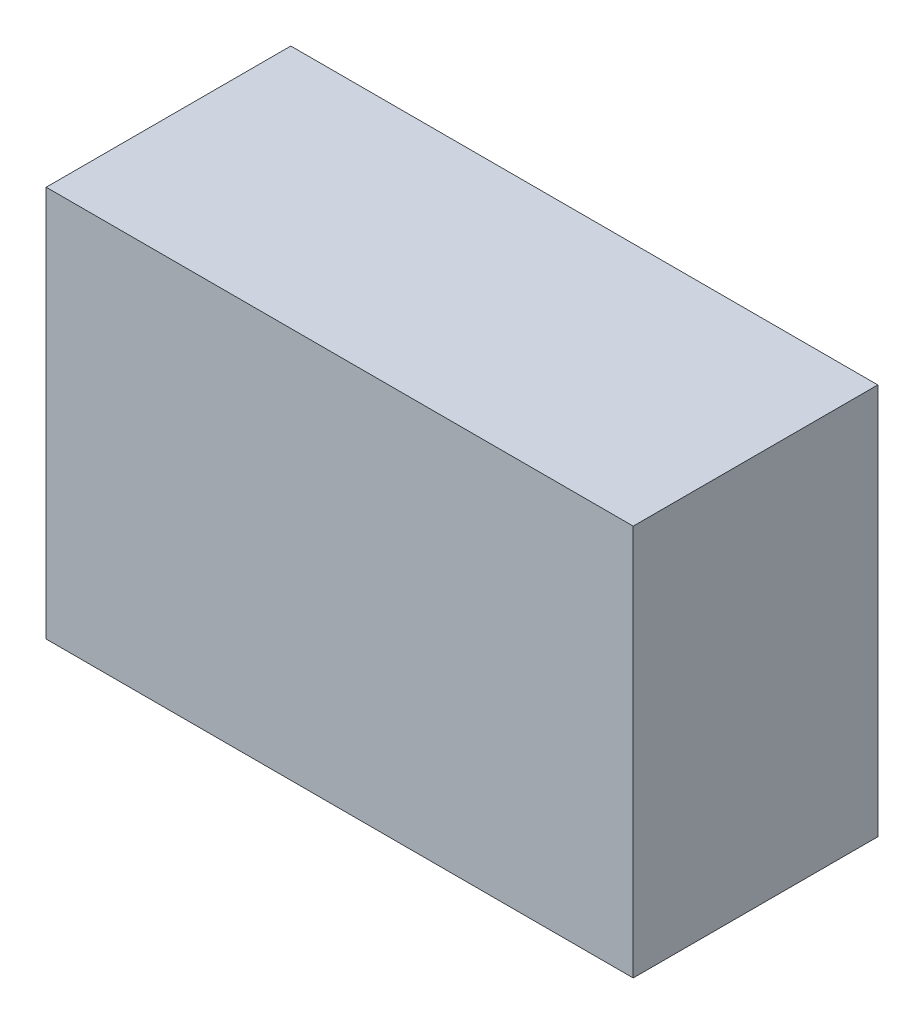
ISO-10303-21;
HEADER;
FILE_DESCRIPTION(('STEP AP214'),'2;1');
FILE_NAME('part.step','',(''),(''),'','','');
FILE_SCHEMA(('AUTOMOTIVE_DESIGN { 1 0 10303 214 1 1 1 1 }'));
ENDSEC;
DATA;
#1=APPLICATION_CONTEXT('core data for automotive mechanical design processes');
#2=APPLICATION_PROTOCOL_DEFINITION('international standard','automotive_design',2000,#1);
#3=PRODUCT_CONTEXT('',#1,'mechanical');
#4=PRODUCT('Part','Part','',(#3));
#5=PRODUCT_RELATED_PRODUCT_CATEGORY('part','',(#4));
#6=PRODUCT_DEFINITION_FORMATION('','',#4);
#7=PRODUCT_DEFINITION_CONTEXT('part definition',#1,'design');
#8=PRODUCT_DEFINITION('design','',#6,#7);
#9=PRODUCT_DEFINITION_SHAPE('','',#8);
#10=(LENGTH_UNIT() NAMED_UNIT(*) SI_UNIT(.MILLI.,.METRE.));
#11=(NAMED_UNIT(*) PLANE_ANGLE_UNIT() SI_UNIT($,.RADIAN.));
#12=(NAMED_UNIT(*) SI_UNIT($,.STERADIAN.) SOLID_ANGLE_UNIT());
#13=UNCERTAINTY_MEASURE_WITH_UNIT(LENGTH_MEASURE(1.E-05),#10,'distance_accuracy_value','');
#14=(GEOMETRIC_REPRESENTATION_CONTEXT(3) GLOBAL_UNCERTAINTY_ASSIGNED_CONTEXT((#13)) GLOBAL_UNIT_ASSIGNED_CONTEXT((#10,
#11,#12)) REPRESENTATION_CONTEXT('',''));
#15=CARTESIAN_POINT('',(0.,0.,0.));
#16=DIRECTION('',(0.,0.,1.));
#17=DIRECTION('',(1.,0.,0.));
#18=AXIS2_PLACEMENT_3D('',#15,#16,#17);
#19=CARTESIAN_POINT('',(0.,8.,5.));
#20=DIRECTION('',(1.,0.,0.));
#21=DIRECTION('',(0.,0.,-1.));
#22=AXIS2_PLACEMENT_3D('',#19,#20,#21);
#23=PLANE('',#22);
#24=DIRECTION('',(0.,-1.,0.));
#25=VECTOR('',#24,1.);
#26=CARTESIAN_POINT('',(0.,8.,0.));
#27=LINE('',#26,#25);
#28=CARTESIAN_POINT('',(0.,8.,0.));
#29=VERTEX_POINT('',#28);
#30=CARTESIAN_POINT('',(0.,0.,0.));
#31=VERTEX_POINT('',#30);
#32=EDGE_CURVE('E102',#29,#31,#27,.T.);
#33=ORIENTED_EDGE('',*,*,#32,.T.);
#34=DIRECTION('',(0.,0.,-1.));
#35=VECTOR('',#34,1.);
#36=CARTESIAN_POINT('',(0.,0.,5.));
#37=LINE('',#36,#35);
#38=CARTESIAN_POINT('',(0.,0.,5.));
#39=VERTEX_POINT('',#38);
#40=EDGE_CURVE('E11',#39,#31,#37,.T.);
#41=ORIENTED_EDGE('',*,*,#40,.F.);
#42=DIRECTION('',(0.,-1.,0.));
#43=VECTOR('',#42,1.);
#44=CARTESIAN_POINT('',(0.,8.,5.));
#45=LINE('',#44,#43);
#46=CARTESIAN_POINT('',(0.,8.,5.));
#47=VERTEX_POINT('',#46);
#48=EDGE_CURVE('E90',#47,#39,#45,.T.);
#49=ORIENTED_EDGE('',*,*,#48,.F.);
#50=DIRECTION('',(0.,0.,-1.));
#51=VECTOR('',#50,1.);
#52=CARTESIAN_POINT('',(0.,8.,5.));
#53=LINE('',#52,#51);
#54=EDGE_CURVE('E98',#47,#29,#53,.T.);
#55=ORIENTED_EDGE('',*,*,#54,.T.);
#56=EDGE_LOOP('',(#33,#41,#49,#55));
#57=FACE_BOUND('',#56,.T.);
#58=ADVANCED_FACE('F39',(#57),#23,.F.);
#59=CARTESIAN_POINT('',(0.,0.,5.));
#60=DIRECTION('',(0.,1.,0.));
#61=DIRECTION('',(0.,0.,1.));
#62=AXIS2_PLACEMENT_3D('',#59,#60,#61);
#63=PLANE('',#62);
#64=DIRECTION('',(1.,0.,0.));
#65=VECTOR('',#64,1.);
#66=CARTESIAN_POINT('',(0.,0.,0.));
#67=LINE('',#66,#65);
#68=CARTESIAN_POINT('',(12.,0.,0.));
#69=VERTEX_POINT('',#68);
#70=EDGE_CURVE('E94',#31,#69,#67,.T.);
#71=ORIENTED_EDGE('',*,*,#70,.T.);
#72=DIRECTION('',(0.,0.,-1.));
#73=VECTOR('',#72,1.);
#74=CARTESIAN_POINT('',(12.,0.,5.));
#75=LINE('',#74,#73);
#76=CARTESIAN_POINT('',(12.,0.,5.));
#77=VERTEX_POINT('',#76);
#78=EDGE_CURVE('E47',#77,#69,#75,.T.);
#79=ORIENTED_EDGE('',*,*,#78,.F.);
#80=DIRECTION('',(1.,0.,0.));
#81=VECTOR('',#80,1.);
#82=CARTESIAN_POINT('',(0.,0.,5.));
#83=LINE('',#82,#81);
#84=EDGE_CURVE('E85',#39,#77,#83,.T.);
#85=ORIENTED_EDGE('',*,*,#84,.F.);
#86=ORIENTED_EDGE('',*,*,#40,.T.);
#87=EDGE_LOOP('',(#71,#79,#85,#86));
#88=FACE_BOUND('',#87,.T.);
#89=ADVANCED_FACE('F93',(#88),#63,.F.);
#90=CARTESIAN_POINT('',(12.,0.,5.));
#91=DIRECTION('',(-1.,0.,0.));
#92=DIRECTION('',(0.,0.,1.));
#93=AXIS2_PLACEMENT_3D('',#90,#91,#92);
#94=PLANE('',#93);
#95=DIRECTION('',(0.,1.,0.));
#96=VECTOR('',#95,1.);
#97=CARTESIAN_POINT('',(12.,0.,0.));
#98=LINE('',#97,#96);
#99=CARTESIAN_POINT('',(12.,8.,0.));
#100=VERTEX_POINT('',#99);
#101=EDGE_CURVE('E72',#69,#100,#98,.T.);
#102=ORIENTED_EDGE('',*,*,#101,.T.);
#103=DIRECTION('',(0.,0.,-1.));
#104=VECTOR('',#103,1.);
#105=CARTESIAN_POINT('',(12.,8.,5.));
#106=LINE('',#105,#104);
#107=CARTESIAN_POINT('',(12.,8.,5.));
#108=VERTEX_POINT('',#107);
#109=EDGE_CURVE('E95',#108,#100,#106,.T.);
#110=ORIENTED_EDGE('',*,*,#109,.F.);
#111=DIRECTION('',(0.,1.,0.));
#112=VECTOR('',#111,1.);
#113=CARTESIAN_POINT('',(12.,0.,5.));
#114=LINE('',#113,#112);
#115=EDGE_CURVE('E88',#77,#108,#114,.T.);
#116=ORIENTED_EDGE('',*,*,#115,.F.);
#117=ORIENTED_EDGE('',*,*,#78,.T.);
#118=EDGE_LOOP('',(#102,#110,#116,#117));
#119=FACE_BOUND('',#118,.T.);
#120=ADVANCED_FACE('F96',(#119),#94,.F.);
#121=CARTESIAN_POINT('',(12.,8.,5.));
#122=DIRECTION('',(0.,-1.,0.));
#123=DIRECTION('',(0.,0.,-1.));
#124=AXIS2_PLACEMENT_3D('',#121,#122,#123);
#125=PLANE('',#124);
#126=DIRECTION('',(-1.,0.,0.));
#127=VECTOR('',#126,1.);
#128=CARTESIAN_POINT('',(12.,8.,0.));
#129=LINE('',#128,#127);
#130=EDGE_CURVE('E78',#100,#29,#129,.T.);
#131=ORIENTED_EDGE('',*,*,#130,.T.);
#132=ORIENTED_EDGE('',*,*,#54,.F.);
#133=DIRECTION('',(-1.,0.,0.));
#134=VECTOR('',#133,1.);
#135=CARTESIAN_POINT('',(12.,8.,5.));
#136=LINE('',#135,#134);
#137=EDGE_CURVE('E55',#108,#47,#136,.T.);
#138=ORIENTED_EDGE('',*,*,#137,.F.);
#139=ORIENTED_EDGE('',*,*,#109,.T.);
#140=EDGE_LOOP('',(#131,#132,#138,#139));
#141=FACE_BOUND('',#140,.T.);
#142=ADVANCED_FACE('F109',(#141),#125,.F.);
#143=CARTESIAN_POINT('',(0.,0.,5.));
#144=DIRECTION('',(0.,0.,1.));
#145=DIRECTION('',(1.,0.,0.));
#146=AXIS2_PLACEMENT_3D('',#143,#144,#145);
#147=PLANE('',#146);
#148=ORIENTED_EDGE('',*,*,#48,.T.);
#149=ORIENTED_EDGE('',*,*,#84,.T.);
#150=ORIENTED_EDGE('',*,*,#115,.T.);
#151=ORIENTED_EDGE('',*,*,#137,.T.);
#152=EDGE_LOOP('',(#148,#149,#150,#151));
#153=FACE_BOUND('',#152,.T.);
#154=ADVANCED_FACE('F86',(#153),#147,.T.);
#155=CARTESIAN_POINT('',(0.,0.,0.));
#156=DIRECTION('',(0.,0.,1.));
#157=DIRECTION('',(1.,0.,0.));
#158=AXIS2_PLACEMENT_3D('',#155,#156,#157);
#159=PLANE('',#158);
#160=ORIENTED_EDGE('',*,*,#32,.F.);
#161=ORIENTED_EDGE('',*,*,#130,.F.);
#162=ORIENTED_EDGE('',*,*,#101,.F.);
#163=ORIENTED_EDGE('',*,*,#70,.F.);
#164=EDGE_LOOP('',(#160,#161,#162,#163));
#165=FACE_BOUND('',#164,.T.);
#166=ADVANCED_FACE('F112',(#165),#159,.F.);
#167=CLOSED_SHELL('',(#58,#89,#120,#142,#154,#166));
#168=MANIFOLD_SOLID_BREP('B2',#167);
#169=ADVANCED_BREP_SHAPE_REPRESENTATION('',(#18,#168),#14);
#170=SHAPE_DEFINITION_REPRESENTATION(#9,#169);
ENDSEC;
END-ISO-10303-21;
